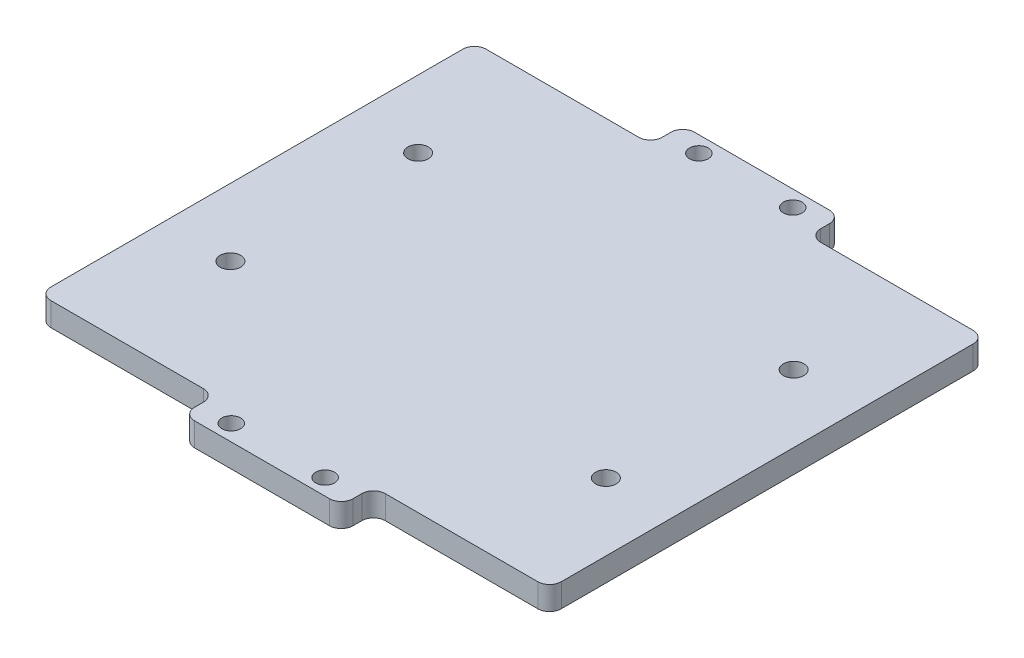
ISO-10303-21;
HEADER;
FILE_DESCRIPTION(('STEP AP214'),'2;1');
FILE_NAME('part.step','',(''),(''),'','','');
FILE_SCHEMA(('AUTOMOTIVE_DESIGN { 1 0 10303 214 1 1 1 1 }'));
ENDSEC;
DATA;
#1=APPLICATION_CONTEXT('core data for automotive mechanical design processes');
#2=APPLICATION_PROTOCOL_DEFINITION('international standard','automotive_design',2000,#1);
#3=PRODUCT_CONTEXT('',#1,'mechanical');
#4=PRODUCT('Part','Part','',(#3));
#5=PRODUCT_RELATED_PRODUCT_CATEGORY('part','',(#4));
#6=PRODUCT_DEFINITION_FORMATION('','',#4);
#7=PRODUCT_DEFINITION_CONTEXT('part definition',#1,'design');
#8=PRODUCT_DEFINITION('design','',#6,#7);
#9=PRODUCT_DEFINITION_SHAPE('','',#8);
#10=(LENGTH_UNIT() NAMED_UNIT(*) SI_UNIT(.MILLI.,.METRE.));
#11=(NAMED_UNIT(*) PLANE_ANGLE_UNIT() SI_UNIT($,.RADIAN.));
#12=(NAMED_UNIT(*) SI_UNIT($,.STERADIAN.) SOLID_ANGLE_UNIT());
#13=UNCERTAINTY_MEASURE_WITH_UNIT(LENGTH_MEASURE(1.E-05),#10,'distance_accuracy_value','');
#14=(GEOMETRIC_REPRESENTATION_CONTEXT(3) GLOBAL_UNCERTAINTY_ASSIGNED_CONTEXT((#13)) GLOBAL_UNIT_ASSIGNED_CONTEXT((#10,
#11,#12)) REPRESENTATION_CONTEXT('',''));
#15=CARTESIAN_POINT('',(0.,0.,0.));
#16=DIRECTION('',(0.,0.,1.));
#17=DIRECTION('',(1.,0.,0.));
#18=AXIS2_PLACEMENT_3D('',#15,#16,#17);
#19=CARTESIAN_POINT('',(43.5,4.,-42.6));
#20=DIRECTION('',(-1.,0.,0.));
#21=DIRECTION('',(0.,0.,1.));
#22=AXIS2_PLACEMENT_3D('',#19,#20,#21);
#23=PLANE('',#22);
#24=DIRECTION('',(0.,0.,-1.));
#25=VECTOR('',#24,1.);
#26=CARTESIAN_POINT('',(43.5,0.,-42.6));
#27=LINE('',#26,#25);
#28=CARTESIAN_POINT('',(43.5,0.,35.1));
#29=VERTEX_POINT('',#28);
#30=CARTESIAN_POINT('',(43.5,0.,-35.1));
#31=VERTEX_POINT('',#30);
#32=EDGE_CURVE('E213',#29,#31,#27,.T.);
#33=ORIENTED_EDGE('',*,*,#32,.T.);
#34=DIRECTION('',(0.,1.,0.));
#35=VECTOR('',#34,1.);
#36=CARTESIAN_POINT('',(43.5,4.,-35.1));
#37=LINE('',#36,#35);
#38=CARTESIAN_POINT('',(43.5,4.,-35.1));
#39=VERTEX_POINT('',#38);
#40=EDGE_CURVE('E217',#31,#39,#37,.T.);
#41=ORIENTED_EDGE('',*,*,#40,.T.);
#42=DIRECTION('',(0.,0.,-1.));
#43=VECTOR('',#42,1.);
#44=CARTESIAN_POINT('',(43.5,4.,-42.6));
#45=LINE('',#44,#43);
#46=CARTESIAN_POINT('',(43.5,4.,35.1));
#47=VERTEX_POINT('',#46);
#48=EDGE_CURVE('E216',#47,#39,#45,.T.);
#49=ORIENTED_EDGE('',*,*,#48,.F.);
#50=DIRECTION('',(0.,-1.,0.));
#51=VECTOR('',#50,1.);
#52=CARTESIAN_POINT('',(43.5,4.,35.1));
#53=LINE('',#52,#51);
#54=EDGE_CURVE('E201',#47,#29,#53,.T.);
#55=ORIENTED_EDGE('',*,*,#54,.T.);
#56=EDGE_LOOP('',(#33,#41,#49,#55));
#57=FACE_BOUND('',#56,.T.);
#58=ADVANCED_FACE('F34',(#57),#23,.F.);
#59=CARTESIAN_POINT('',(-43.5,4.,-42.6));
#60=DIRECTION('',(0.,0.,1.));
#61=DIRECTION('',(1.,0.,0.));
#62=AXIS2_PLACEMENT_3D('',#59,#60,#61);
#63=PLANE('',#62);
#64=DIRECTION('',(-1.,0.,0.));
#65=VECTOR('',#64,1.);
#66=CARTESIAN_POINT('',(-43.5,0.,-42.6));
#67=LINE('',#66,#65);
#68=CARTESIAN_POINT('',(11.5,0.,-42.6));
#69=VERTEX_POINT('',#68);
#70=CARTESIAN_POINT('',(-11.5,0.,-42.6));
#71=VERTEX_POINT('',#70);
#72=EDGE_CURVE('E223',#69,#71,#67,.T.);
#73=ORIENTED_EDGE('',*,*,#72,.T.);
#74=DIRECTION('',(0.,1.,0.));
#75=VECTOR('',#74,1.);
#76=CARTESIAN_POINT('',(-11.5,4.,-42.6));
#77=LINE('',#76,#75);
#78=CARTESIAN_POINT('',(-11.5,4.,-42.6));
#79=VERTEX_POINT('',#78);
#80=EDGE_CURVE('E321',#71,#79,#77,.T.);
#81=ORIENTED_EDGE('',*,*,#80,.T.);
#82=DIRECTION('',(-1.,0.,0.));
#83=VECTOR('',#82,1.);
#84=CARTESIAN_POINT('',(-43.5,4.,-42.6));
#85=LINE('',#84,#83);
#86=CARTESIAN_POINT('',(11.5,4.,-42.6));
#87=VERTEX_POINT('',#86);
#88=EDGE_CURVE('E393',#87,#79,#85,.T.);
#89=ORIENTED_EDGE('',*,*,#88,.F.);
#90=DIRECTION('',(0.,-1.,0.));
#91=VECTOR('',#90,1.);
#92=CARTESIAN_POINT('',(11.5,4.,-42.6));
#93=LINE('',#92,#91);
#94=EDGE_CURVE('E319',#87,#69,#93,.T.);
#95=ORIENTED_EDGE('',*,*,#94,.T.);
#96=EDGE_LOOP('',(#73,#81,#89,#95));
#97=FACE_BOUND('',#96,.T.);
#98=ADVANCED_FACE('F454',(#97),#63,.F.);
#99=CARTESIAN_POINT('',(-43.5,4.,-42.6));
#100=DIRECTION('',(1.,0.,0.));
#101=DIRECTION('',(0.,0.,-1.));
#102=AXIS2_PLACEMENT_3D('',#99,#100,#101);
#103=PLANE('',#102);
#104=DIRECTION('',(0.,0.,1.));
#105=VECTOR('',#104,1.);
#106=CARTESIAN_POINT('',(-43.5,0.,-42.6));
#107=LINE('',#106,#105);
#108=CARTESIAN_POINT('',(-43.5,0.,-35.1));
#109=VERTEX_POINT('',#108);
#110=CARTESIAN_POINT('',(-43.5,0.,35.1));
#111=VERTEX_POINT('',#110);
#112=EDGE_CURVE('E226',#109,#111,#107,.T.);
#113=ORIENTED_EDGE('',*,*,#112,.T.);
#114=DIRECTION('',(0.,1.,0.));
#115=VECTOR('',#114,1.);
#116=CARTESIAN_POINT('',(-43.5,4.,35.1));
#117=LINE('',#116,#115);
#118=CARTESIAN_POINT('',(-43.5,4.,35.1));
#119=VERTEX_POINT('',#118);
#120=EDGE_CURVE('E307',#111,#119,#117,.T.);
#121=ORIENTED_EDGE('',*,*,#120,.T.);
#122=DIRECTION('',(0.,0.,1.));
#123=VECTOR('',#122,1.);
#124=CARTESIAN_POINT('',(-43.5,4.,-42.6));
#125=LINE('',#124,#123);
#126=CARTESIAN_POINT('',(-43.5,4.,-35.1));
#127=VERTEX_POINT('',#126);
#128=EDGE_CURVE('E395',#127,#119,#125,.T.);
#129=ORIENTED_EDGE('',*,*,#128,.F.);
#130=DIRECTION('',(0.,-1.,0.));
#131=VECTOR('',#130,1.);
#132=CARTESIAN_POINT('',(-43.5,4.,-35.1));
#133=LINE('',#132,#131);
#134=EDGE_CURVE('E304',#127,#109,#133,.T.);
#135=ORIENTED_EDGE('',*,*,#134,.T.);
#136=EDGE_LOOP('',(#113,#121,#129,#135));
#137=FACE_BOUND('',#136,.T.);
#138=ADVANCED_FACE('F430',(#137),#103,.F.);
#139=CARTESIAN_POINT('',(-43.5,4.,42.6));
#140=DIRECTION('',(0.,0.,-1.));
#141=DIRECTION('',(-1.,0.,0.));
#142=AXIS2_PLACEMENT_3D('',#139,#140,#141);
#143=PLANE('',#142);
#144=DIRECTION('',(1.,0.,0.));
#145=VECTOR('',#144,1.);
#146=CARTESIAN_POINT('',(-43.5,0.,42.6));
#147=LINE('',#146,#145);
#148=CARTESIAN_POINT('',(-11.5,0.,42.6));
#149=VERTEX_POINT('',#148);
#150=CARTESIAN_POINT('',(11.5,0.,42.6));
#151=VERTEX_POINT('',#150);
#152=EDGE_CURVE('E236',#149,#151,#147,.T.);
#153=ORIENTED_EDGE('',*,*,#152,.T.);
#154=DIRECTION('',(0.,1.,0.));
#155=VECTOR('',#154,1.);
#156=CARTESIAN_POINT('',(11.5,4.,42.6));
#157=LINE('',#156,#155);
#158=CARTESIAN_POINT('',(11.5,4.,42.6));
#159=VERTEX_POINT('',#158);
#160=EDGE_CURVE('E292',#151,#159,#157,.T.);
#161=ORIENTED_EDGE('',*,*,#160,.T.);
#162=DIRECTION('',(1.,0.,0.));
#163=VECTOR('',#162,1.);
#164=CARTESIAN_POINT('',(-43.5,4.,42.6));
#165=LINE('',#164,#163);
#166=CARTESIAN_POINT('',(-11.5,4.,42.6));
#167=VERTEX_POINT('',#166);
#168=EDGE_CURVE('E231',#167,#159,#165,.T.);
#169=ORIENTED_EDGE('',*,*,#168,.F.);
#170=DIRECTION('',(0.,-1.,0.));
#171=VECTOR('',#170,1.);
#172=CARTESIAN_POINT('',(-11.5,4.,42.6));
#173=LINE('',#172,#171);
#174=EDGE_CURVE('E289',#167,#149,#173,.T.);
#175=ORIENTED_EDGE('',*,*,#174,.T.);
#176=EDGE_LOOP('',(#153,#161,#169,#175));
#177=FACE_BOUND('',#176,.T.);
#178=ADVANCED_FACE('F405',(#177),#143,.F.);
#179=CARTESIAN_POINT('',(0.,4.,0.));
#180=DIRECTION('',(0.,1.,0.));
#181=DIRECTION('',(0.,0.,1.));
#182=AXIS2_PLACEMENT_3D('',#179,#180,#181);
#183=PLANE('',#182);
#184=CARTESIAN_POINT('',(8.,4.,-39.85));
#185=DIRECTION('',(0.,1.,0.));
#186=DIRECTION('',(0.,0.,1.));
#187=AXIS2_PLACEMENT_3D('',#184,#185,#186);
#188=CIRCLE('',#187,1.6);
#189=CARTESIAN_POINT('',(8.,4.,-38.25));
#190=VERTEX_POINT('',#189);
#191=EDGE_CURVE('E757',#190,#190,#188,.T.);
#192=ORIENTED_EDGE('',*,*,#191,.F.);
#193=EDGE_LOOP('',(#192));
#194=FACE_BOUND('',#193,.T.);
#195=CARTESIAN_POINT('',(8.,4.,39.85));
#196=DIRECTION('',(0.,1.,0.));
#197=DIRECTION('',(0.,0.,-1.));
#198=AXIS2_PLACEMENT_3D('',#195,#196,#197);
#199=CIRCLE('',#198,1.6);
#200=CARTESIAN_POINT('',(8.,4.,38.25));
#201=VERTEX_POINT('',#200);
#202=EDGE_CURVE('E761',#201,#201,#199,.T.);
#203=ORIENTED_EDGE('',*,*,#202,.F.);
#204=EDGE_LOOP('',(#203));
#205=FACE_BOUND('',#204,.T.);
#206=CARTESIAN_POINT('',(-8.,4.,39.85));
#207=DIRECTION('',(0.,1.,0.));
#208=DIRECTION('',(0.,0.,-1.));
#209=AXIS2_PLACEMENT_3D('',#206,#207,#208);
#210=CIRCLE('',#209,1.6);
#211=CARTESIAN_POINT('',(-8.,4.,38.25));
#212=VERTEX_POINT('',#211);
#213=EDGE_CURVE('E765',#212,#212,#210,.T.);
#214=ORIENTED_EDGE('',*,*,#213,.F.);
#215=EDGE_LOOP('',(#214));
#216=FACE_BOUND('',#215,.T.);
#217=CARTESIAN_POINT('',(-8.,4.,-39.85));
#218=DIRECTION('',(0.,1.,0.));
#219=DIRECTION('',(0.,0.,1.));
#220=AXIS2_PLACEMENT_3D('',#217,#218,#219);
#221=CIRCLE('',#220,1.6);
#222=CARTESIAN_POINT('',(-8.,4.,-38.25));
#223=VERTEX_POINT('',#222);
#224=EDGE_CURVE('E769',#223,#223,#221,.T.);
#225=ORIENTED_EDGE('',*,*,#224,.F.);
#226=EDGE_LOOP('',(#225));
#227=FACE_BOUND('',#226,.T.);
#228=CARTESIAN_POINT('',(32.,4.,-16.));
#229=DIRECTION('',(0.,1.,0.));
#230=DIRECTION('',(0.,0.,1.));
#231=AXIS2_PLACEMENT_3D('',#228,#229,#230);
#232=CIRCLE('',#231,1.75);
#233=CARTESIAN_POINT('',(32.,4.,-14.25));
#234=VERTEX_POINT('',#233);
#235=EDGE_CURVE('E773',#234,#234,#232,.T.);
#236=ORIENTED_EDGE('',*,*,#235,.F.);
#237=EDGE_LOOP('',(#236));
#238=FACE_BOUND('',#237,.T.);
#239=CARTESIAN_POINT('',(-32.,4.,16.));
#240=DIRECTION('',(0.,1.,0.));
#241=DIRECTION('',(0.,0.,1.));
#242=AXIS2_PLACEMENT_3D('',#239,#240,#241);
#243=CIRCLE('',#242,1.75);
#244=CARTESIAN_POINT('',(-32.,4.,17.75));
#245=VERTEX_POINT('',#244);
#246=EDGE_CURVE('E777',#245,#245,#243,.T.);
#247=ORIENTED_EDGE('',*,*,#246,.F.);
#248=EDGE_LOOP('',(#247));
#249=FACE_BOUND('',#248,.T.);
#250=CARTESIAN_POINT('',(32.,4.,16.));
#251=DIRECTION('',(0.,1.,0.));
#252=DIRECTION('',(0.,0.,1.));
#253=AXIS2_PLACEMENT_3D('',#250,#251,#252);
#254=CIRCLE('',#253,1.75);
#255=CARTESIAN_POINT('',(32.,4.,17.75));
#256=VERTEX_POINT('',#255);
#257=EDGE_CURVE('E781',#256,#256,#254,.T.);
#258=ORIENTED_EDGE('',*,*,#257,.F.);
#259=EDGE_LOOP('',(#258));
#260=FACE_BOUND('',#259,.T.);
#261=CARTESIAN_POINT('',(-32.,4.,-16.));
#262=DIRECTION('',(0.,1.,0.));
#263=DIRECTION('',(0.,0.,1.));
#264=AXIS2_PLACEMENT_3D('',#261,#262,#263);
#265=CIRCLE('',#264,1.75);
#266=CARTESIAN_POINT('',(-32.,4.,-14.25));
#267=VERTEX_POINT('',#266);
#268=EDGE_CURVE('E369',#267,#267,#265,.T.);
#269=ORIENTED_EDGE('',*,*,#268,.F.);
#270=EDGE_LOOP('',(#269));
#271=FACE_BOUND('',#270,.T.);
#272=ORIENTED_EDGE('',*,*,#48,.T.);
#273=CARTESIAN_POINT('',(41.5,4.,-35.1));
#274=DIRECTION('',(0.,1.,0.));
#275=DIRECTION('',(0.,0.,1.));
#276=AXIS2_PLACEMENT_3D('',#273,#274,#275);
#277=CIRCLE('',#276,2.);
#278=CARTESIAN_POINT('',(41.5,4.,-37.1));
#279=VERTEX_POINT('',#278);
#280=EDGE_CURVE('E264',#39,#279,#277,.T.);
#281=ORIENTED_EDGE('',*,*,#280,.T.);
#282=DIRECTION('',(1.,0.,0.));
#283=VECTOR('',#282,1.);
#284=CARTESIAN_POINT('',(13.5,4.,-37.1));
#285=LINE('',#284,#283);
#286=CARTESIAN_POINT('',(15.5,4.,-37.1));
#287=VERTEX_POINT('',#286);
#288=EDGE_CURVE('E347',#287,#279,#285,.T.);
#289=ORIENTED_EDGE('',*,*,#288,.F.);
#290=CARTESIAN_POINT('',(15.5,4.,-39.1));
#291=DIRECTION('',(0.,1.,0.));
#292=DIRECTION('',(0.,0.,1.));
#293=AXIS2_PLACEMENT_3D('',#290,#291,#292);
#294=CIRCLE('',#293,2.);
#295=CARTESIAN_POINT('',(13.5,4.,-39.1));
#296=VERTEX_POINT('',#295);
#297=EDGE_CURVE('E42',#287,#296,#294,.F.);
#298=ORIENTED_EDGE('',*,*,#297,.T.);
#299=DIRECTION('',(0.,0.,1.));
#300=VECTOR('',#299,1.);
#301=CARTESIAN_POINT('',(13.5,4.,-37.1));
#302=LINE('',#301,#300);
#303=CARTESIAN_POINT('',(13.5,4.,-40.6));
#304=VERTEX_POINT('',#303);
#305=EDGE_CURVE('E344',#304,#296,#302,.T.);
#306=ORIENTED_EDGE('',*,*,#305,.F.);
#307=CARTESIAN_POINT('',(11.5,4.,-40.6));
#308=DIRECTION('',(0.,1.,0.));
#309=DIRECTION('',(0.,0.,1.));
#310=AXIS2_PLACEMENT_3D('',#307,#308,#309);
#311=CIRCLE('',#310,2.);
#312=EDGE_CURVE('E252',#304,#87,#311,.T.);
#313=ORIENTED_EDGE('',*,*,#312,.T.);
#314=ORIENTED_EDGE('',*,*,#88,.T.);
#315=CARTESIAN_POINT('',(-11.5,4.,-40.6));
#316=DIRECTION('',(0.,1.,0.));
#317=DIRECTION('',(0.,0.,1.));
#318=AXIS2_PLACEMENT_3D('',#315,#316,#317);
#319=CIRCLE('',#318,2.);
#320=CARTESIAN_POINT('',(-13.5,4.,-40.6));
#321=VERTEX_POINT('',#320);
#322=EDGE_CURVE('E254',#79,#321,#319,.T.);
#323=ORIENTED_EDGE('',*,*,#322,.T.);
#324=DIRECTION('',(0.,0.,-1.));
#325=VECTOR('',#324,1.);
#326=CARTESIAN_POINT('',(-13.5,4.,-48.1));
#327=LINE('',#326,#325);
#328=CARTESIAN_POINT('',(-13.5,4.,-39.1));
#329=VERTEX_POINT('',#328);
#330=EDGE_CURVE('E363',#329,#321,#327,.T.);
#331=ORIENTED_EDGE('',*,*,#330,.F.);
#332=CARTESIAN_POINT('',(-15.5,4.,-39.1));
#333=DIRECTION('',(0.,1.,0.));
#334=DIRECTION('',(0.,0.,1.));
#335=AXIS2_PLACEMENT_3D('',#332,#333,#334);
#336=CIRCLE('',#335,2.);
#337=CARTESIAN_POINT('',(-15.5,4.,-37.1));
#338=VERTEX_POINT('',#337);
#339=EDGE_CURVE('E336',#329,#338,#336,.F.);
#340=ORIENTED_EDGE('',*,*,#339,.T.);
#341=DIRECTION('',(1.,0.,0.));
#342=VECTOR('',#341,1.);
#343=CARTESIAN_POINT('',(-73.5,4.,-37.1));
#344=LINE('',#343,#342);
#345=CARTESIAN_POINT('',(-41.5,4.,-37.1));
#346=VERTEX_POINT('',#345);
#347=EDGE_CURVE('E228',#346,#338,#344,.T.);
#348=ORIENTED_EDGE('',*,*,#347,.F.);
#349=CARTESIAN_POINT('',(-41.5,4.,-35.1));
#350=DIRECTION('',(0.,1.,0.));
#351=DIRECTION('',(0.,0.,1.));
#352=AXIS2_PLACEMENT_3D('',#349,#350,#351);
#353=CIRCLE('',#352,2.);
#354=EDGE_CURVE('E250',#346,#127,#353,.T.);
#355=ORIENTED_EDGE('',*,*,#354,.T.);
#356=ORIENTED_EDGE('',*,*,#128,.T.);
#357=CARTESIAN_POINT('',(-41.5,4.,35.1));
#358=DIRECTION('',(0.,1.,0.));
#359=DIRECTION('',(0.,0.,1.));
#360=AXIS2_PLACEMENT_3D('',#357,#358,#359);
#361=CIRCLE('',#360,2.);
#362=CARTESIAN_POINT('',(-41.5,4.,37.1));
#363=VERTEX_POINT('',#362);
#364=EDGE_CURVE('E256',#119,#363,#361,.T.);
#365=ORIENTED_EDGE('',*,*,#364,.T.);
#366=DIRECTION('',(-1.,0.,0.));
#367=VECTOR('',#366,1.);
#368=CARTESIAN_POINT('',(-73.5,4.,37.1));
#369=LINE('',#368,#367);
#370=CARTESIAN_POINT('',(-15.5,4.,37.1));
#371=VERTEX_POINT('',#370);
#372=EDGE_CURVE('E383',#371,#363,#369,.T.);
#373=ORIENTED_EDGE('',*,*,#372,.F.);
#374=CARTESIAN_POINT('',(-15.5,4.,39.1));
#375=DIRECTION('',(0.,1.,0.));
#376=DIRECTION('',(0.,0.,1.));
#377=AXIS2_PLACEMENT_3D('',#374,#375,#376);
#378=CIRCLE('',#377,2.);
#379=CARTESIAN_POINT('',(-13.5,4.,39.1));
#380=VERTEX_POINT('',#379);
#381=EDGE_CURVE('E332',#371,#380,#378,.F.);
#382=ORIENTED_EDGE('',*,*,#381,.T.);
#383=DIRECTION('',(0.,0.,-1.));
#384=VECTOR('',#383,1.);
#385=CARTESIAN_POINT('',(-13.5,4.,48.1));
#386=LINE('',#385,#384);
#387=CARTESIAN_POINT('',(-13.5,4.,40.6));
#388=VERTEX_POINT('',#387);
#389=EDGE_CURVE('E384',#388,#380,#386,.T.);
#390=ORIENTED_EDGE('',*,*,#389,.F.);
#391=CARTESIAN_POINT('',(-11.5,4.,40.6));
#392=DIRECTION('',(0.,1.,0.));
#393=DIRECTION('',(0.,0.,1.));
#394=AXIS2_PLACEMENT_3D('',#391,#392,#393);
#395=CIRCLE('',#394,2.);
#396=EDGE_CURVE('E258',#388,#167,#395,.T.);
#397=ORIENTED_EDGE('',*,*,#396,.T.);
#398=ORIENTED_EDGE('',*,*,#168,.T.);
#399=CARTESIAN_POINT('',(11.5,4.,40.6));
#400=DIRECTION('',(0.,1.,0.));
#401=DIRECTION('',(0.,0.,1.));
#402=AXIS2_PLACEMENT_3D('',#399,#400,#401);
#403=CIRCLE('',#402,2.);
#404=CARTESIAN_POINT('',(13.5,4.,40.6));
#405=VERTEX_POINT('',#404);
#406=EDGE_CURVE('E260',#159,#405,#403,.T.);
#407=ORIENTED_EDGE('',*,*,#406,.T.);
#408=DIRECTION('',(0.,0.,1.));
#409=VECTOR('',#408,1.);
#410=CARTESIAN_POINT('',(13.5,4.,37.1));
#411=LINE('',#410,#409);
#412=CARTESIAN_POINT('',(13.5,4.,39.1));
#413=VERTEX_POINT('',#412);
#414=EDGE_CURVE('E374',#413,#405,#411,.T.);
#415=ORIENTED_EDGE('',*,*,#414,.F.);
#416=CARTESIAN_POINT('',(15.5,4.,39.1));
#417=DIRECTION('',(0.,1.,0.));
#418=DIRECTION('',(0.,0.,1.));
#419=AXIS2_PLACEMENT_3D('',#416,#417,#418);
#420=CIRCLE('',#419,2.);
#421=CARTESIAN_POINT('',(15.5,4.,37.1));
#422=VERTEX_POINT('',#421);
#423=EDGE_CURVE('E328',#413,#422,#420,.F.);
#424=ORIENTED_EDGE('',*,*,#423,.T.);
#425=DIRECTION('',(-1.,0.,0.));
#426=VECTOR('',#425,1.);
#427=CARTESIAN_POINT('',(13.5,4.,37.1));
#428=LINE('',#427,#426);
#429=CARTESIAN_POINT('',(41.5,4.,37.1));
#430=VERTEX_POINT('',#429);
#431=EDGE_CURVE('E375',#430,#422,#428,.T.);
#432=ORIENTED_EDGE('',*,*,#431,.F.);
#433=CARTESIAN_POINT('',(41.5,4.,35.1));
#434=DIRECTION('',(0.,1.,0.));
#435=DIRECTION('',(0.,0.,1.));
#436=AXIS2_PLACEMENT_3D('',#433,#434,#435);
#437=CIRCLE('',#436,2.);
#438=EDGE_CURVE('E262',#430,#47,#437,.T.);
#439=ORIENTED_EDGE('',*,*,#438,.T.);
#440=EDGE_LOOP('',(#272,#281,#289,#298,#306,#313,#314,#323,#331,#340,#348,#355,#356,#365,#373,
#382,#390,#397,#398,#407,#415,#424,#432,#439));
#441=FACE_BOUND('',#440,.T.);
#442=ADVANCED_FACE('F343',(#194,#205,#216,#227,#238,#249,#260,#271,#441),#183,.T.);
#443=CARTESIAN_POINT('',(0.,0.,0.));
#444=DIRECTION('',(0.,1.,0.));
#445=DIRECTION('',(0.,0.,1.));
#446=AXIS2_PLACEMENT_3D('',#443,#444,#445);
#447=PLANE('',#446);
#448=CARTESIAN_POINT('',(8.,0.,-39.85));
#449=DIRECTION('',(0.,1.,0.));
#450=DIRECTION('',(0.,0.,1.));
#451=AXIS2_PLACEMENT_3D('',#448,#449,#450);
#452=CIRCLE('',#451,1.6);
#453=CARTESIAN_POINT('',(8.,0.,-38.25));
#454=VERTEX_POINT('',#453);
#455=EDGE_CURVE('E807',#454,#454,#452,.T.);
#456=ORIENTED_EDGE('',*,*,#455,.T.);
#457=EDGE_LOOP('',(#456));
#458=FACE_BOUND('',#457,.T.);
#459=CARTESIAN_POINT('',(8.,0.,39.85));
#460=DIRECTION('',(0.,1.,0.));
#461=DIRECTION('',(0.,0.,-1.));
#462=AXIS2_PLACEMENT_3D('',#459,#460,#461);
#463=CIRCLE('',#462,1.6);
#464=CARTESIAN_POINT('',(8.,0.,38.25));
#465=VERTEX_POINT('',#464);
#466=EDGE_CURVE('E814',#465,#465,#463,.T.);
#467=ORIENTED_EDGE('',*,*,#466,.T.);
#468=EDGE_LOOP('',(#467));
#469=FACE_BOUND('',#468,.T.);
#470=CARTESIAN_POINT('',(-8.,0.,39.85));
#471=DIRECTION('',(0.,1.,0.));
#472=DIRECTION('',(0.,0.,-1.));
#473=AXIS2_PLACEMENT_3D('',#470,#471,#472);
#474=CIRCLE('',#473,1.6);
#475=CARTESIAN_POINT('',(-8.,0.,38.25));
#476=VERTEX_POINT('',#475);
#477=EDGE_CURVE('E810',#476,#476,#474,.T.);
#478=ORIENTED_EDGE('',*,*,#477,.T.);
#479=EDGE_LOOP('',(#478));
#480=FACE_BOUND('',#479,.T.);
#481=CARTESIAN_POINT('',(-8.,0.,-39.85));
#482=DIRECTION('',(0.,1.,0.));
#483=DIRECTION('',(0.,0.,1.));
#484=AXIS2_PLACEMENT_3D('',#481,#482,#483);
#485=CIRCLE('',#484,1.6);
#486=CARTESIAN_POINT('',(-8.,0.,-38.25));
#487=VERTEX_POINT('',#486);
#488=EDGE_CURVE('E802',#487,#487,#485,.T.);
#489=ORIENTED_EDGE('',*,*,#488,.T.);
#490=EDGE_LOOP('',(#489));
#491=FACE_BOUND('',#490,.T.);
#492=CARTESIAN_POINT('',(32.,0.,-16.));
#493=DIRECTION('',(0.,1.,0.));
#494=DIRECTION('',(0.,0.,1.));
#495=AXIS2_PLACEMENT_3D('',#492,#493,#494);
#496=CIRCLE('',#495,1.75);
#497=CARTESIAN_POINT('',(32.,0.,-14.25));
#498=VERTEX_POINT('',#497);
#499=EDGE_CURVE('E785',#498,#498,#496,.T.);
#500=ORIENTED_EDGE('',*,*,#499,.T.);
#501=EDGE_LOOP('',(#500));
#502=FACE_BOUND('',#501,.T.);
#503=CARTESIAN_POINT('',(-32.,0.,16.));
#504=DIRECTION('',(0.,1.,0.));
#505=DIRECTION('',(0.,0.,1.));
#506=AXIS2_PLACEMENT_3D('',#503,#504,#505);
#507=CIRCLE('',#506,1.75);
#508=CARTESIAN_POINT('',(-32.,0.,17.75));
#509=VERTEX_POINT('',#508);
#510=EDGE_CURVE('E791',#509,#509,#507,.T.);
#511=ORIENTED_EDGE('',*,*,#510,.T.);
#512=EDGE_LOOP('',(#511));
#513=FACE_BOUND('',#512,.T.);
#514=CARTESIAN_POINT('',(32.,0.,16.));
#515=DIRECTION('',(0.,1.,0.));
#516=DIRECTION('',(0.,0.,1.));
#517=AXIS2_PLACEMENT_3D('',#514,#515,#516);
#518=CIRCLE('',#517,1.75);
#519=CARTESIAN_POINT('',(32.,0.,17.75));
#520=VERTEX_POINT('',#519);
#521=EDGE_CURVE('E799',#520,#520,#518,.T.);
#522=ORIENTED_EDGE('',*,*,#521,.T.);
#523=EDGE_LOOP('',(#522));
#524=FACE_BOUND('',#523,.T.);
#525=CARTESIAN_POINT('',(-32.,0.,-16.));
#526=DIRECTION('',(0.,1.,0.));
#527=DIRECTION('',(0.,0.,1.));
#528=AXIS2_PLACEMENT_3D('',#525,#526,#527);
#529=CIRCLE('',#528,1.75);
#530=CARTESIAN_POINT('',(-32.,0.,-14.25));
#531=VERTEX_POINT('',#530);
#532=EDGE_CURVE('E387',#531,#531,#529,.T.);
#533=ORIENTED_EDGE('',*,*,#532,.T.);
#534=EDGE_LOOP('',(#533));
#535=FACE_BOUND('',#534,.T.);
#536=DIRECTION('',(1.,0.,0.));
#537=VECTOR('',#536,1.);
#538=CARTESIAN_POINT('',(13.5,0.,-37.1));
#539=LINE('',#538,#537);
#540=CARTESIAN_POINT('',(15.5,0.,-37.1));
#541=VERTEX_POINT('',#540);
#542=CARTESIAN_POINT('',(41.5,0.,-37.1));
#543=VERTEX_POINT('',#542);
#544=EDGE_CURVE('E359',#541,#543,#539,.T.);
#545=ORIENTED_EDGE('',*,*,#544,.T.);
#546=CARTESIAN_POINT('',(41.5,0.,-35.1));
#547=DIRECTION('',(0.,1.,0.));
#548=DIRECTION('',(0.,0.,1.));
#549=AXIS2_PLACEMENT_3D('',#546,#547,#548);
#550=CIRCLE('',#549,2.);
#551=EDGE_CURVE('E206',#543,#31,#550,.F.);
#552=ORIENTED_EDGE('',*,*,#551,.T.);
#553=ORIENTED_EDGE('',*,*,#32,.F.);
#554=CARTESIAN_POINT('',(41.5,0.,35.1));
#555=DIRECTION('',(0.,1.,0.));
#556=DIRECTION('',(0.,0.,1.));
#557=AXIS2_PLACEMENT_3D('',#554,#555,#556);
#558=CIRCLE('',#557,2.);
#559=CARTESIAN_POINT('',(41.5,0.,37.1));
#560=VERTEX_POINT('',#559);
#561=EDGE_CURVE('E197',#29,#560,#558,.F.);
#562=ORIENTED_EDGE('',*,*,#561,.T.);
#563=DIRECTION('',(-1.,0.,0.));
#564=VECTOR('',#563,1.);
#565=CARTESIAN_POINT('',(0.,0.,37.1));
#566=LINE('',#565,#564);
#567=CARTESIAN_POINT('',(15.5,0.,37.1));
#568=VERTEX_POINT('',#567);
#569=EDGE_CURVE('E245',#560,#568,#566,.T.);
#570=ORIENTED_EDGE('',*,*,#569,.T.);
#571=CARTESIAN_POINT('',(15.5,0.,39.1));
#572=DIRECTION('',(0.,1.,0.));
#573=DIRECTION('',(0.,0.,1.));
#574=AXIS2_PLACEMENT_3D('',#571,#572,#573);
#575=CIRCLE('',#574,2.);
#576=CARTESIAN_POINT('',(13.5,0.,39.1));
#577=VERTEX_POINT('',#576);
#578=EDGE_CURVE('E330',#568,#577,#575,.T.);
#579=ORIENTED_EDGE('',*,*,#578,.T.);
#580=DIRECTION('',(0.,0.,1.));
#581=VECTOR('',#580,1.);
#582=CARTESIAN_POINT('',(13.5,0.,37.1));
#583=LINE('',#582,#581);
#584=CARTESIAN_POINT('',(13.5,0.,40.6));
#585=VERTEX_POINT('',#584);
#586=EDGE_CURVE('E354',#577,#585,#583,.T.);
#587=ORIENTED_EDGE('',*,*,#586,.T.);
#588=CARTESIAN_POINT('',(11.5,0.,40.6));
#589=DIRECTION('',(0.,1.,0.));
#590=DIRECTION('',(0.,0.,1.));
#591=AXIS2_PLACEMENT_3D('',#588,#589,#590);
#592=CIRCLE('',#591,2.);
#593=EDGE_CURVE('E207',#585,#151,#592,.F.);
#594=ORIENTED_EDGE('',*,*,#593,.T.);
#595=ORIENTED_EDGE('',*,*,#152,.F.);
#596=CARTESIAN_POINT('',(-11.5,0.,40.6));
#597=DIRECTION('',(0.,1.,0.));
#598=DIRECTION('',(0.,0.,1.));
#599=AXIS2_PLACEMENT_3D('',#596,#597,#598);
#600=CIRCLE('',#599,2.);
#601=CARTESIAN_POINT('',(-13.5,0.,40.6));
#602=VERTEX_POINT('',#601);
#603=EDGE_CURVE('E277',#149,#602,#600,.F.);
#604=ORIENTED_EDGE('',*,*,#603,.T.);
#605=DIRECTION('',(0.,0.,-1.));
#606=VECTOR('',#605,1.);
#607=CARTESIAN_POINT('',(-13.5,0.,0.));
#608=LINE('',#607,#606);
#609=CARTESIAN_POINT('',(-13.5,0.,39.1));
#610=VERTEX_POINT('',#609);
#611=EDGE_CURVE('E242',#602,#610,#608,.T.);
#612=ORIENTED_EDGE('',*,*,#611,.T.);
#613=CARTESIAN_POINT('',(-15.5,0.,39.1));
#614=DIRECTION('',(0.,1.,0.));
#615=DIRECTION('',(0.,0.,1.));
#616=AXIS2_PLACEMENT_3D('',#613,#614,#615);
#617=CIRCLE('',#616,2.);
#618=CARTESIAN_POINT('',(-15.5,0.,37.1));
#619=VERTEX_POINT('',#618);
#620=EDGE_CURVE('E334',#610,#619,#617,.T.);
#621=ORIENTED_EDGE('',*,*,#620,.T.);
#622=DIRECTION('',(-1.,0.,0.));
#623=VECTOR('',#622,1.);
#624=CARTESIAN_POINT('',(-73.5,0.,37.1));
#625=LINE('',#624,#623);
#626=CARTESIAN_POINT('',(-41.5,0.,37.1));
#627=VERTEX_POINT('',#626);
#628=EDGE_CURVE('E378',#619,#627,#625,.T.);
#629=ORIENTED_EDGE('',*,*,#628,.T.);
#630=CARTESIAN_POINT('',(-41.5,0.,35.1));
#631=DIRECTION('',(0.,1.,0.));
#632=DIRECTION('',(0.,0.,1.));
#633=AXIS2_PLACEMENT_3D('',#630,#631,#632);
#634=CIRCLE('',#633,2.);
#635=EDGE_CURVE('E275',#627,#111,#634,.F.);
#636=ORIENTED_EDGE('',*,*,#635,.T.);
#637=ORIENTED_EDGE('',*,*,#112,.F.);
#638=CARTESIAN_POINT('',(-41.5,0.,-35.1));
#639=DIRECTION('',(0.,1.,0.));
#640=DIRECTION('',(0.,0.,1.));
#641=AXIS2_PLACEMENT_3D('',#638,#639,#640);
#642=CIRCLE('',#641,2.);
#643=CARTESIAN_POINT('',(-41.5,0.,-37.1));
#644=VERTEX_POINT('',#643);
#645=EDGE_CURVE('E271',#109,#644,#642,.F.);
#646=ORIENTED_EDGE('',*,*,#645,.T.);
#647=DIRECTION('',(1.,0.,0.));
#648=VECTOR('',#647,1.);
#649=CARTESIAN_POINT('',(0.,0.,-37.1));
#650=LINE('',#649,#648);
#651=CARTESIAN_POINT('',(-15.5,0.,-37.1));
#652=VERTEX_POINT('',#651);
#653=EDGE_CURVE('E239',#644,#652,#650,.T.);
#654=ORIENTED_EDGE('',*,*,#653,.T.);
#655=CARTESIAN_POINT('',(-15.5,0.,-39.1));
#656=DIRECTION('',(0.,1.,0.));
#657=DIRECTION('',(0.,0.,1.));
#658=AXIS2_PLACEMENT_3D('',#655,#656,#657);
#659=CIRCLE('',#658,2.);
#660=CARTESIAN_POINT('',(-13.5,0.,-39.1));
#661=VERTEX_POINT('',#660);
#662=EDGE_CURVE('E338',#652,#661,#659,.T.);
#663=ORIENTED_EDGE('',*,*,#662,.T.);
#664=DIRECTION('',(0.,0.,-1.));
#665=VECTOR('',#664,1.);
#666=CARTESIAN_POINT('',(-13.5,0.,-48.1));
#667=LINE('',#666,#665);
#668=CARTESIAN_POINT('',(-13.5,0.,-40.6));
#669=VERTEX_POINT('',#668);
#670=EDGE_CURVE('E224',#661,#669,#667,.T.);
#671=ORIENTED_EDGE('',*,*,#670,.T.);
#672=CARTESIAN_POINT('',(-11.5,0.,-40.6));
#673=DIRECTION('',(0.,1.,0.));
#674=DIRECTION('',(0.,0.,1.));
#675=AXIS2_PLACEMENT_3D('',#672,#673,#674);
#676=CIRCLE('',#675,2.);
#677=EDGE_CURVE('E49',#669,#71,#676,.F.);
#678=ORIENTED_EDGE('',*,*,#677,.T.);
#679=ORIENTED_EDGE('',*,*,#72,.F.);
#680=CARTESIAN_POINT('',(11.5,0.,-40.6));
#681=DIRECTION('',(0.,1.,0.));
#682=DIRECTION('',(0.,0.,1.));
#683=AXIS2_PLACEMENT_3D('',#680,#681,#682);
#684=CIRCLE('',#683,2.);
#685=CARTESIAN_POINT('',(13.5,0.,-40.6));
#686=VERTEX_POINT('',#685);
#687=EDGE_CURVE('E57',#69,#686,#684,.F.);
#688=ORIENTED_EDGE('',*,*,#687,.T.);
#689=DIRECTION('',(0.,0.,1.));
#690=VECTOR('',#689,1.);
#691=CARTESIAN_POINT('',(13.5,0.,0.));
#692=LINE('',#691,#690);
#693=CARTESIAN_POINT('',(13.5,0.,-39.1));
#694=VERTEX_POINT('',#693);
#695=EDGE_CURVE('E218',#686,#694,#692,.T.);
#696=ORIENTED_EDGE('',*,*,#695,.T.);
#697=CARTESIAN_POINT('',(15.5,0.,-39.1));
#698=DIRECTION('',(0.,1.,0.));
#699=DIRECTION('',(0.,0.,1.));
#700=AXIS2_PLACEMENT_3D('',#697,#698,#699);
#701=CIRCLE('',#700,2.);
#702=EDGE_CURVE('E11',#694,#541,#701,.T.);
#703=ORIENTED_EDGE('',*,*,#702,.T.);
#704=EDGE_LOOP('',(#545,#552,#553,#562,#570,#579,#587,#594,#595,#604,#612,#621,#629,#636,#637,
#646,#654,#663,#671,#678,#679,#688,#696,#703));
#705=FACE_BOUND('',#704,.T.);
#706=ADVANCED_FACE('F221',(#458,#469,#480,#491,#502,#513,#524,#535,#705),#447,.F.);
#707=CARTESIAN_POINT('',(-13.5,0.,-48.1));
#708=DIRECTION('',(1.,0.,0.));
#709=DIRECTION('',(0.,0.,-1.));
#710=AXIS2_PLACEMENT_3D('',#707,#708,#709);
#711=PLANE('',#710);
#712=ORIENTED_EDGE('',*,*,#670,.F.);
#713=DIRECTION('',(0.,1.,0.));
#714=VECTOR('',#713,1.);
#715=CARTESIAN_POINT('',(-13.5,4.,-39.1));
#716=LINE('',#715,#714);
#717=EDGE_CURVE('E312',#661,#329,#716,.T.);
#718=ORIENTED_EDGE('',*,*,#717,.T.);
#719=ORIENTED_EDGE('',*,*,#330,.T.);
#720=DIRECTION('',(0.,1.,0.));
#721=VECTOR('',#720,1.);
#722=CARTESIAN_POINT('',(-13.5,0.,-40.6));
#723=LINE('',#722,#721);
#724=EDGE_CURVE('E310',#321,#669,#723,.F.);
#725=ORIENTED_EDGE('',*,*,#724,.T.);
#726=EDGE_LOOP('',(#712,#718,#719,#725));
#727=FACE_BOUND('',#726,.T.);
#728=ADVANCED_FACE('F446',(#727),#711,.F.);
#729=CARTESIAN_POINT('',(-73.5,0.,-37.1));
#730=DIRECTION('',(0.,0.,1.));
#731=DIRECTION('',(1.,0.,0.));
#732=AXIS2_PLACEMENT_3D('',#729,#730,#731);
#733=PLANE('',#732);
#734=ORIENTED_EDGE('',*,*,#347,.T.);
#735=DIRECTION('',(0.,1.,0.));
#736=VECTOR('',#735,1.);
#737=CARTESIAN_POINT('',(-15.5,0.,-37.1));
#738=LINE('',#737,#736);
#739=EDGE_CURVE('E317',#338,#652,#738,.F.);
#740=ORIENTED_EDGE('',*,*,#739,.T.);
#741=ORIENTED_EDGE('',*,*,#653,.F.);
#742=DIRECTION('',(0.,-1.,0.));
#743=VECTOR('',#742,1.);
#744=CARTESIAN_POINT('',(-41.5,0.,-37.1));
#745=LINE('',#744,#743);
#746=EDGE_CURVE('E315',#644,#346,#745,.F.);
#747=ORIENTED_EDGE('',*,*,#746,.T.);
#748=EDGE_LOOP('',(#734,#740,#741,#747));
#749=FACE_BOUND('',#748,.T.);
#750=ADVANCED_FACE('F438',(#749),#733,.F.);
#751=CARTESIAN_POINT('',(-73.5,0.,37.1));
#752=DIRECTION('',(0.,0.,-1.));
#753=DIRECTION('',(-1.,0.,0.));
#754=AXIS2_PLACEMENT_3D('',#751,#752,#753);
#755=PLANE('',#754);
#756=ORIENTED_EDGE('',*,*,#628,.F.);
#757=DIRECTION('',(0.,1.,0.));
#758=VECTOR('',#757,1.);
#759=CARTESIAN_POINT('',(-15.5,4.,37.1));
#760=LINE('',#759,#758);
#761=EDGE_CURVE('E301',#619,#371,#760,.T.);
#762=ORIENTED_EDGE('',*,*,#761,.T.);
#763=ORIENTED_EDGE('',*,*,#372,.T.);
#764=DIRECTION('',(0.,1.,0.));
#765=VECTOR('',#764,1.);
#766=CARTESIAN_POINT('',(-41.5,0.,37.1));
#767=LINE('',#766,#765);
#768=EDGE_CURVE('E299',#363,#627,#767,.F.);
#769=ORIENTED_EDGE('',*,*,#768,.T.);
#770=EDGE_LOOP('',(#756,#762,#763,#769));
#771=FACE_BOUND('',#770,.T.);
#772=ADVANCED_FACE('F422',(#771),#755,.F.);
#773=CARTESIAN_POINT('',(-13.5,0.,48.1));
#774=DIRECTION('',(1.,0.,0.));
#775=DIRECTION('',(0.,0.,-1.));
#776=AXIS2_PLACEMENT_3D('',#773,#774,#775);
#777=PLANE('',#776);
#778=ORIENTED_EDGE('',*,*,#611,.F.);
#779=DIRECTION('',(0.,-1.,0.));
#780=VECTOR('',#779,1.);
#781=CARTESIAN_POINT('',(-13.5,0.,40.6));
#782=LINE('',#781,#780);
#783=EDGE_CURVE('E297',#602,#388,#782,.F.);
#784=ORIENTED_EDGE('',*,*,#783,.T.);
#785=ORIENTED_EDGE('',*,*,#389,.T.);
#786=DIRECTION('',(0.,1.,0.));
#787=VECTOR('',#786,1.);
#788=CARTESIAN_POINT('',(-13.5,0.,39.1));
#789=LINE('',#788,#787);
#790=EDGE_CURVE('E295',#380,#610,#789,.F.);
#791=ORIENTED_EDGE('',*,*,#790,.T.);
#792=EDGE_LOOP('',(#778,#784,#785,#791));
#793=FACE_BOUND('',#792,.T.);
#794=ADVANCED_FACE('F414',(#793),#777,.F.);
#795=CARTESIAN_POINT('',(13.5,0.,37.1));
#796=DIRECTION('',(0.,0.,-1.));
#797=DIRECTION('',(-1.,0.,0.));
#798=AXIS2_PLACEMENT_3D('',#795,#796,#797);
#799=PLANE('',#798);
#800=ORIENTED_EDGE('',*,*,#569,.F.);
#801=DIRECTION('',(0.,-1.,0.));
#802=VECTOR('',#801,1.);
#803=CARTESIAN_POINT('',(41.5,0.,37.1));
#804=LINE('',#803,#802);
#805=EDGE_CURVE('E202',#560,#430,#804,.F.);
#806=ORIENTED_EDGE('',*,*,#805,.T.);
#807=ORIENTED_EDGE('',*,*,#431,.T.);
#808=DIRECTION('',(0.,1.,0.));
#809=VECTOR('',#808,1.);
#810=CARTESIAN_POINT('',(15.5,0.,37.1));
#811=LINE('',#810,#809);
#812=EDGE_CURVE('E281',#422,#568,#811,.F.);
#813=ORIENTED_EDGE('',*,*,#812,.T.);
#814=EDGE_LOOP('',(#800,#806,#807,#813));
#815=FACE_BOUND('',#814,.T.);
#816=ADVANCED_FACE('F650',(#815),#799,.F.);
#817=CARTESIAN_POINT('',(13.5,0.,37.1));
#818=DIRECTION('',(-1.,0.,0.));
#819=DIRECTION('',(0.,0.,1.));
#820=AXIS2_PLACEMENT_3D('',#817,#818,#819);
#821=PLANE('',#820);
#822=ORIENTED_EDGE('',*,*,#586,.F.);
#823=DIRECTION('',(0.,1.,0.));
#824=VECTOR('',#823,1.);
#825=CARTESIAN_POINT('',(13.5,4.,39.1));
#826=LINE('',#825,#824);
#827=EDGE_CURVE('E286',#577,#413,#826,.T.);
#828=ORIENTED_EDGE('',*,*,#827,.T.);
#829=ORIENTED_EDGE('',*,*,#414,.T.);
#830=DIRECTION('',(0.,1.,0.));
#831=VECTOR('',#830,1.);
#832=CARTESIAN_POINT('',(13.5,0.,40.6));
#833=LINE('',#832,#831);
#834=EDGE_CURVE('E284',#405,#585,#833,.F.);
#835=ORIENTED_EDGE('',*,*,#834,.T.);
#836=EDGE_LOOP('',(#822,#828,#829,#835));
#837=FACE_BOUND('',#836,.T.);
#838=ADVANCED_FACE('F642',(#837),#821,.F.);
#839=CARTESIAN_POINT('',(13.5,0.,-37.1));
#840=DIRECTION('',(0.,0.,1.));
#841=DIRECTION('',(1.,0.,0.));
#842=AXIS2_PLACEMENT_3D('',#839,#840,#841);
#843=PLANE('',#842);
#844=ORIENTED_EDGE('',*,*,#288,.T.);
#845=DIRECTION('',(0.,1.,0.));
#846=VECTOR('',#845,1.);
#847=CARTESIAN_POINT('',(41.5,0.,-37.1));
#848=LINE('',#847,#846);
#849=EDGE_CURVE('E269',#279,#543,#848,.F.);
#850=ORIENTED_EDGE('',*,*,#849,.T.);
#851=ORIENTED_EDGE('',*,*,#544,.F.);
#852=DIRECTION('',(0.,1.,0.));
#853=VECTOR('',#852,1.);
#854=CARTESIAN_POINT('',(15.5,4.,-37.1));
#855=LINE('',#854,#853);
#856=EDGE_CURVE('E266',#541,#287,#855,.T.);
#857=ORIENTED_EDGE('',*,*,#856,.T.);
#858=EDGE_LOOP('',(#844,#850,#851,#857));
#859=FACE_BOUND('',#858,.T.);
#860=ADVANCED_FACE('F361',(#859),#843,.F.);
#861=CARTESIAN_POINT('',(13.5,0.,-37.1));
#862=DIRECTION('',(-1.,0.,0.));
#863=DIRECTION('',(0.,0.,1.));
#864=AXIS2_PLACEMENT_3D('',#861,#862,#863);
#865=PLANE('',#864);
#866=ORIENTED_EDGE('',*,*,#695,.F.);
#867=DIRECTION('',(0.,-1.,0.));
#868=VECTOR('',#867,1.);
#869=CARTESIAN_POINT('',(13.5,0.,-40.6));
#870=LINE('',#869,#868);
#871=EDGE_CURVE('E326',#686,#304,#870,.F.);
#872=ORIENTED_EDGE('',*,*,#871,.T.);
#873=ORIENTED_EDGE('',*,*,#305,.T.);
#874=DIRECTION('',(0.,1.,0.));
#875=VECTOR('',#874,1.);
#876=CARTESIAN_POINT('',(13.5,0.,-39.1));
#877=LINE('',#876,#875);
#878=EDGE_CURVE('E324',#296,#694,#877,.F.);
#879=ORIENTED_EDGE('',*,*,#878,.T.);
#880=EDGE_LOOP('',(#866,#872,#873,#879));
#881=FACE_BOUND('',#880,.T.);
#882=ADVANCED_FACE('F353',(#881),#865,.F.);
#883=CARTESIAN_POINT('',(-32.,0.,-16.));
#884=DIRECTION('',(0.,1.,0.));
#885=DIRECTION('',(0.,0.,1.));
#886=AXIS2_PLACEMENT_3D('',#883,#884,#885);
#887=CYLINDRICAL_SURFACE('',#886,1.75);
#888=ORIENTED_EDGE('',*,*,#532,.F.);
#889=EDGE_LOOP('',(#888));
#890=FACE_BOUND('',#889,.T.);
#891=ORIENTED_EDGE('',*,*,#268,.T.);
#892=EDGE_LOOP('',(#891));
#893=FACE_BOUND('',#892,.T.);
#894=ADVANCED_FACE('F619',(#890,#893),#887,.F.);
#895=CARTESIAN_POINT('',(32.,0.,16.));
#896=DIRECTION('',(0.,1.,0.));
#897=DIRECTION('',(0.,0.,1.));
#898=AXIS2_PLACEMENT_3D('',#895,#896,#897);
#899=CYLINDRICAL_SURFACE('',#898,1.75);
#900=ORIENTED_EDGE('',*,*,#521,.F.);
#901=EDGE_LOOP('',(#900));
#902=FACE_BOUND('',#901,.T.);
#903=ORIENTED_EDGE('',*,*,#257,.T.);
#904=EDGE_LOOP('',(#903));
#905=FACE_BOUND('',#904,.T.);
#906=ADVANCED_FACE('F610',(#902,#905),#899,.F.);
#907=CARTESIAN_POINT('',(-32.,0.,16.));
#908=DIRECTION('',(0.,1.,0.));
#909=DIRECTION('',(0.,0.,1.));
#910=AXIS2_PLACEMENT_3D('',#907,#908,#909);
#911=CYLINDRICAL_SURFACE('',#910,1.75);
#912=ORIENTED_EDGE('',*,*,#510,.F.);
#913=EDGE_LOOP('',(#912));
#914=FACE_BOUND('',#913,.T.);
#915=ORIENTED_EDGE('',*,*,#246,.T.);
#916=EDGE_LOOP('',(#915));
#917=FACE_BOUND('',#916,.T.);
#918=ADVANCED_FACE('F601',(#914,#917),#911,.F.);
#919=CARTESIAN_POINT('',(32.,0.,-16.));
#920=DIRECTION('',(0.,1.,0.));
#921=DIRECTION('',(0.,0.,1.));
#922=AXIS2_PLACEMENT_3D('',#919,#920,#921);
#923=CYLINDRICAL_SURFACE('',#922,1.75);
#924=ORIENTED_EDGE('',*,*,#499,.F.);
#925=EDGE_LOOP('',(#924));
#926=FACE_BOUND('',#925,.T.);
#927=ORIENTED_EDGE('',*,*,#235,.T.);
#928=EDGE_LOOP('',(#927));
#929=FACE_BOUND('',#928,.T.);
#930=ADVANCED_FACE('F592',(#926,#929),#923,.F.);
#931=CARTESIAN_POINT('',(-8.,0.,-39.85));
#932=DIRECTION('',(0.,1.,0.));
#933=DIRECTION('',(0.,0.,1.));
#934=AXIS2_PLACEMENT_3D('',#931,#932,#933);
#935=CYLINDRICAL_SURFACE('',#934,1.6);
#936=ORIENTED_EDGE('',*,*,#488,.F.);
#937=EDGE_LOOP('',(#936));
#938=FACE_BOUND('',#937,.T.);
#939=ORIENTED_EDGE('',*,*,#224,.T.);
#940=EDGE_LOOP('',(#939));
#941=FACE_BOUND('',#940,.T.);
#942=ADVANCED_FACE('F583',(#938,#941),#935,.F.);
#943=CARTESIAN_POINT('',(-8.,0.,39.85));
#944=DIRECTION('',(0.,1.,0.));
#945=DIRECTION('',(0.,0.,1.));
#946=AXIS2_PLACEMENT_3D('',#943,#944,#945);
#947=CYLINDRICAL_SURFACE('',#946,1.6);
#948=ORIENTED_EDGE('',*,*,#477,.F.);
#949=EDGE_LOOP('',(#948));
#950=FACE_BOUND('',#949,.T.);
#951=ORIENTED_EDGE('',*,*,#213,.T.);
#952=EDGE_LOOP('',(#951));
#953=FACE_BOUND('',#952,.T.);
#954=ADVANCED_FACE('F574',(#950,#953),#947,.F.);
#955=CARTESIAN_POINT('',(8.,0.,39.85));
#956=DIRECTION('',(0.,1.,0.));
#957=DIRECTION('',(0.,0.,1.));
#958=AXIS2_PLACEMENT_3D('',#955,#956,#957);
#959=CYLINDRICAL_SURFACE('',#958,1.6);
#960=ORIENTED_EDGE('',*,*,#466,.F.);
#961=EDGE_LOOP('',(#960));
#962=FACE_BOUND('',#961,.T.);
#963=ORIENTED_EDGE('',*,*,#202,.T.);
#964=EDGE_LOOP('',(#963));
#965=FACE_BOUND('',#964,.T.);
#966=ADVANCED_FACE('F565',(#962,#965),#959,.F.);
#967=CARTESIAN_POINT('',(8.,0.,-39.85));
#968=DIRECTION('',(0.,1.,0.));
#969=DIRECTION('',(0.,0.,1.));
#970=AXIS2_PLACEMENT_3D('',#967,#968,#969);
#971=CYLINDRICAL_SURFACE('',#970,1.6);
#972=ORIENTED_EDGE('',*,*,#455,.F.);
#973=EDGE_LOOP('',(#972));
#974=FACE_BOUND('',#973,.T.);
#975=ORIENTED_EDGE('',*,*,#191,.T.);
#976=EDGE_LOOP('',(#975));
#977=FACE_BOUND('',#976,.T.);
#978=ADVANCED_FACE('F474',(#974,#977),#971,.F.);
#979=CARTESIAN_POINT('',(41.5,4.,-35.1));
#980=DIRECTION('',(0.,1.,0.));
#981=DIRECTION('',(0.,0.,1.));
#982=AXIS2_PLACEMENT_3D('',#979,#980,#981);
#983=CYLINDRICAL_SURFACE('',#982,2.);
#984=ORIENTED_EDGE('',*,*,#551,.F.);
#985=ORIENTED_EDGE('',*,*,#849,.F.);
#986=ORIENTED_EDGE('',*,*,#280,.F.);
#987=ORIENTED_EDGE('',*,*,#40,.F.);
#988=EDGE_LOOP('',(#984,#985,#986,#987));
#989=FACE_BOUND('',#988,.T.);
#990=ADVANCED_FACE('F471',(#989),#983,.T.);
#991=CARTESIAN_POINT('',(41.5,4.,35.1));
#992=DIRECTION('',(0.,-1.,0.));
#993=DIRECTION('',(0.,0.,-1.));
#994=AXIS2_PLACEMENT_3D('',#991,#992,#993);
#995=CYLINDRICAL_SURFACE('',#994,2.);
#996=ORIENTED_EDGE('',*,*,#438,.F.);
#997=ORIENTED_EDGE('',*,*,#805,.F.);
#998=ORIENTED_EDGE('',*,*,#561,.F.);
#999=ORIENTED_EDGE('',*,*,#54,.F.);
#1000=EDGE_LOOP('',(#996,#997,#998,#999));
#1001=FACE_BOUND('',#1000,.T.);
#1002=ADVANCED_FACE('F200',(#1001),#995,.T.);
#1003=CARTESIAN_POINT('',(15.5,0.,39.1));
#1004=DIRECTION('',(0.,-1.,0.));
#1005=DIRECTION('',(0.,0.,-1.));
#1006=AXIS2_PLACEMENT_3D('',#1003,#1004,#1005);
#1007=CYLINDRICAL_SURFACE('',#1006,2.);
#1008=ORIENTED_EDGE('',*,*,#578,.F.);
#1009=ORIENTED_EDGE('',*,*,#812,.F.);
#1010=ORIENTED_EDGE('',*,*,#423,.F.);
#1011=ORIENTED_EDGE('',*,*,#827,.F.);
#1012=EDGE_LOOP('',(#1008,#1009,#1010,#1011));
#1013=FACE_BOUND('',#1012,.T.);
#1014=ADVANCED_FACE('F478',(#1013),#1007,.F.);
#1015=CARTESIAN_POINT('',(11.5,4.,40.6));
#1016=DIRECTION('',(0.,1.,0.));
#1017=DIRECTION('',(0.,0.,1.));
#1018=AXIS2_PLACEMENT_3D('',#1015,#1016,#1017);
#1019=CYLINDRICAL_SURFACE('',#1018,2.);
#1020=ORIENTED_EDGE('',*,*,#593,.F.);
#1021=ORIENTED_EDGE('',*,*,#834,.F.);
#1022=ORIENTED_EDGE('',*,*,#406,.F.);
#1023=ORIENTED_EDGE('',*,*,#160,.F.);
#1024=EDGE_LOOP('',(#1020,#1021,#1022,#1023));
#1025=FACE_BOUND('',#1024,.T.);
#1026=ADVANCED_FACE('F481',(#1025),#1019,.T.);
#1027=CARTESIAN_POINT('',(-11.5,4.,40.6));
#1028=DIRECTION('',(0.,-1.,0.));
#1029=DIRECTION('',(0.,0.,-1.));
#1030=AXIS2_PLACEMENT_3D('',#1027,#1028,#1029);
#1031=CYLINDRICAL_SURFACE('',#1030,2.);
#1032=ORIENTED_EDGE('',*,*,#396,.F.);
#1033=ORIENTED_EDGE('',*,*,#783,.F.);
#1034=ORIENTED_EDGE('',*,*,#603,.F.);
#1035=ORIENTED_EDGE('',*,*,#174,.F.);
#1036=EDGE_LOOP('',(#1032,#1033,#1034,#1035));
#1037=FACE_BOUND('',#1036,.T.);
#1038=ADVANCED_FACE('F409',(#1037),#1031,.T.);
#1039=CARTESIAN_POINT('',(-15.5,0.,39.1));
#1040=DIRECTION('',(0.,-1.,0.));
#1041=DIRECTION('',(0.,0.,-1.));
#1042=AXIS2_PLACEMENT_3D('',#1039,#1040,#1041);
#1043=CYLINDRICAL_SURFACE('',#1042,2.);
#1044=ORIENTED_EDGE('',*,*,#620,.F.);
#1045=ORIENTED_EDGE('',*,*,#790,.F.);
#1046=ORIENTED_EDGE('',*,*,#381,.F.);
#1047=ORIENTED_EDGE('',*,*,#761,.F.);
#1048=EDGE_LOOP('',(#1044,#1045,#1046,#1047));
#1049=FACE_BOUND('',#1048,.T.);
#1050=ADVANCED_FACE('F417',(#1049),#1043,.F.);
#1051=CARTESIAN_POINT('',(-41.5,4.,35.1));
#1052=DIRECTION('',(0.,1.,0.));
#1053=DIRECTION('',(0.,0.,1.));
#1054=AXIS2_PLACEMENT_3D('',#1051,#1052,#1053);
#1055=CYLINDRICAL_SURFACE('',#1054,2.);
#1056=ORIENTED_EDGE('',*,*,#635,.F.);
#1057=ORIENTED_EDGE('',*,*,#768,.F.);
#1058=ORIENTED_EDGE('',*,*,#364,.F.);
#1059=ORIENTED_EDGE('',*,*,#120,.F.);
#1060=EDGE_LOOP('',(#1056,#1057,#1058,#1059));
#1061=FACE_BOUND('',#1060,.T.);
#1062=ADVANCED_FACE('F426',(#1061),#1055,.T.);
#1063=CARTESIAN_POINT('',(-15.5,0.,-39.1));
#1064=DIRECTION('',(0.,-1.,0.));
#1065=DIRECTION('',(0.,0.,-1.));
#1066=AXIS2_PLACEMENT_3D('',#1063,#1064,#1065);
#1067=CYLINDRICAL_SURFACE('',#1066,2.);
#1068=ORIENTED_EDGE('',*,*,#662,.F.);
#1069=ORIENTED_EDGE('',*,*,#739,.F.);
#1070=ORIENTED_EDGE('',*,*,#339,.F.);
#1071=ORIENTED_EDGE('',*,*,#717,.F.);
#1072=EDGE_LOOP('',(#1068,#1069,#1070,#1071));
#1073=FACE_BOUND('',#1072,.T.);
#1074=ADVANCED_FACE('F442',(#1073),#1067,.F.);
#1075=CARTESIAN_POINT('',(-11.5,4.,-40.6));
#1076=DIRECTION('',(0.,1.,0.));
#1077=DIRECTION('',(0.,0.,1.));
#1078=AXIS2_PLACEMENT_3D('',#1075,#1076,#1077);
#1079=CYLINDRICAL_SURFACE('',#1078,2.);
#1080=ORIENTED_EDGE('',*,*,#677,.F.);
#1081=ORIENTED_EDGE('',*,*,#724,.F.);
#1082=ORIENTED_EDGE('',*,*,#322,.F.);
#1083=ORIENTED_EDGE('',*,*,#80,.F.);
#1084=EDGE_LOOP('',(#1080,#1081,#1082,#1083));
#1085=FACE_BOUND('',#1084,.T.);
#1086=ADVANCED_FACE('F450',(#1085),#1079,.T.);
#1087=CARTESIAN_POINT('',(11.5,4.,-40.6));
#1088=DIRECTION('',(0.,-1.,0.));
#1089=DIRECTION('',(0.,0.,-1.));
#1090=AXIS2_PLACEMENT_3D('',#1087,#1088,#1089);
#1091=CYLINDRICAL_SURFACE('',#1090,2.);
#1092=ORIENTED_EDGE('',*,*,#312,.F.);
#1093=ORIENTED_EDGE('',*,*,#871,.F.);
#1094=ORIENTED_EDGE('',*,*,#687,.F.);
#1095=ORIENTED_EDGE('',*,*,#94,.F.);
#1096=EDGE_LOOP('',(#1092,#1093,#1094,#1095));
#1097=FACE_BOUND('',#1096,.T.);
#1098=ADVANCED_FACE('F455',(#1097),#1091,.T.);
#1099=CARTESIAN_POINT('',(15.5,0.,-39.1));
#1100=DIRECTION('',(0.,-1.,0.));
#1101=DIRECTION('',(0.,0.,-1.));
#1102=AXIS2_PLACEMENT_3D('',#1099,#1100,#1101);
#1103=CYLINDRICAL_SURFACE('',#1102,2.);
#1104=ORIENTED_EDGE('',*,*,#702,.F.);
#1105=ORIENTED_EDGE('',*,*,#878,.F.);
#1106=ORIENTED_EDGE('',*,*,#297,.F.);
#1107=ORIENTED_EDGE('',*,*,#856,.F.);
#1108=EDGE_LOOP('',(#1104,#1105,#1106,#1107));
#1109=FACE_BOUND('',#1108,.T.);
#1110=ADVANCED_FACE('F357',(#1109),#1103,.F.);
#1111=CARTESIAN_POINT('',(-41.5,4.,-35.1));
#1112=DIRECTION('',(0.,-1.,0.));
#1113=DIRECTION('',(0.,0.,-1.));
#1114=AXIS2_PLACEMENT_3D('',#1111,#1112,#1113);
#1115=CYLINDRICAL_SURFACE('',#1114,2.);
#1116=ORIENTED_EDGE('',*,*,#354,.F.);
#1117=ORIENTED_EDGE('',*,*,#746,.F.);
#1118=ORIENTED_EDGE('',*,*,#645,.F.);
#1119=ORIENTED_EDGE('',*,*,#134,.F.);
#1120=EDGE_LOOP('',(#1116,#1117,#1118,#1119));
#1121=FACE_BOUND('',#1120,.T.);
#1122=ADVANCED_FACE('F36',(#1121),#1115,.T.);
#1123=CLOSED_SHELL('',(#58,#98,#138,#178,#442,#706,#728,#750,#772,#794,#816,#838,#860,#882,#894,
#906,#918,#930,#942,#954,#966,#978,#990,#1002,#1014,#1026,#1038,#1050,#1062,#1074,#1086,#1098,
#1110,#1122));
#1124=MANIFOLD_SOLID_BREP('B2',#1123);
#1125=ADVANCED_BREP_SHAPE_REPRESENTATION('',(#18,#1124),#14);
#1126=SHAPE_DEFINITION_REPRESENTATION(#9,#1125);
ENDSEC;
END-ISO-10303-21;
